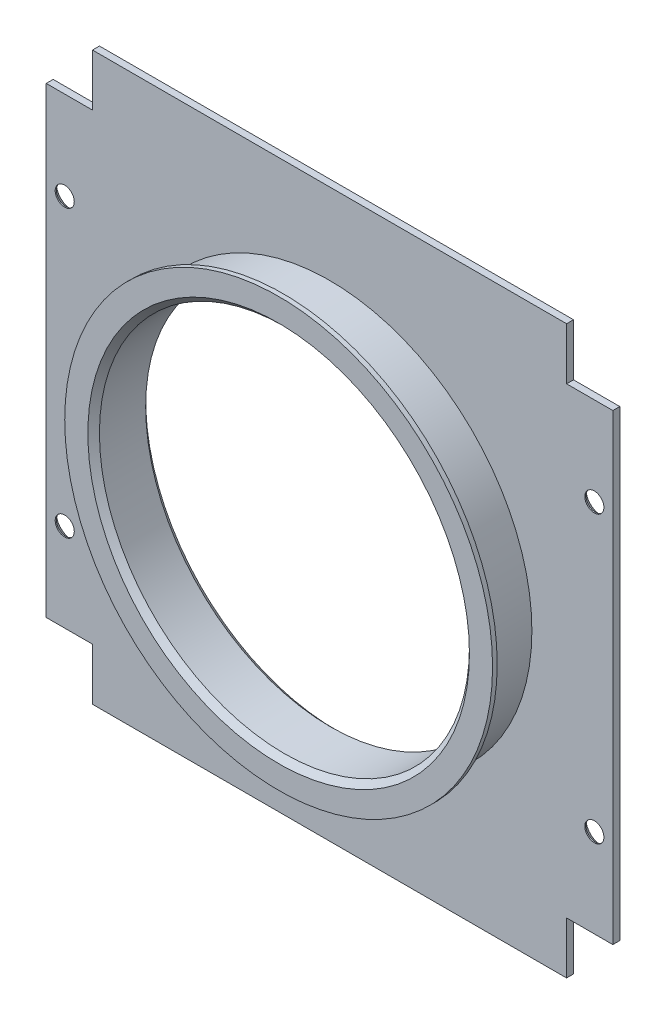
ISO-10303-21;
HEADER;
FILE_DESCRIPTION(('STEP AP214'),'2;1');
FILE_NAME('part.step','',(''),(''),'','','');
FILE_SCHEMA(('AUTOMOTIVE_DESIGN { 1 0 10303 214 1 1 1 1 }'));
ENDSEC;
DATA;
#1=APPLICATION_CONTEXT('core data for automotive mechanical design processes');
#2=APPLICATION_PROTOCOL_DEFINITION('international standard','automotive_design',2000,#1);
#3=PRODUCT_CONTEXT('',#1,'mechanical');
#4=PRODUCT('Part','Part','',(#3));
#5=PRODUCT_RELATED_PRODUCT_CATEGORY('part','',(#4));
#6=PRODUCT_DEFINITION_FORMATION('','',#4);
#7=PRODUCT_DEFINITION_CONTEXT('part definition',#1,'design');
#8=PRODUCT_DEFINITION('design','',#6,#7);
#9=PRODUCT_DEFINITION_SHAPE('','',#8);
#10=(LENGTH_UNIT() NAMED_UNIT(*) SI_UNIT(.MILLI.,.METRE.));
#11=(NAMED_UNIT(*) PLANE_ANGLE_UNIT() SI_UNIT($,.RADIAN.));
#12=(NAMED_UNIT(*) SI_UNIT($,.STERADIAN.) SOLID_ANGLE_UNIT());
#13=UNCERTAINTY_MEASURE_WITH_UNIT(LENGTH_MEASURE(1.E-05),#10,'distance_accuracy_value','');
#14=(GEOMETRIC_REPRESENTATION_CONTEXT(3) GLOBAL_UNCERTAINTY_ASSIGNED_CONTEXT((#13)) GLOBAL_UNIT_ASSIGNED_CONTEXT((#10,
#11,#12)) REPRESENTATION_CONTEXT('',''));
#15=CARTESIAN_POINT('',(0.,0.,0.));
#16=DIRECTION('',(0.,0.,1.));
#17=DIRECTION('',(1.,0.,0.));
#18=AXIS2_PLACEMENT_3D('',#15,#16,#17);
#19=CARTESIAN_POINT('',(-90.,9.,1.2));
#20=DIRECTION('',(1.,0.,0.));
#21=DIRECTION('',(0.,0.,-1.));
#22=AXIS2_PLACEMENT_3D('',#19,#20,#21);
#23=PLANE('',#22);
#24=DIRECTION('',(0.,-1.,0.));
#25=VECTOR('',#24,1.);
#26=CARTESIAN_POINT('',(-90.,9.,0.));
#27=LINE('',#26,#25);
#28=CARTESIAN_POINT('',(-90.,9.,0.));
#29=VERTEX_POINT('',#28);
#30=CARTESIAN_POINT('',(-90.,0.,0.));
#31=VERTEX_POINT('',#30);
#32=EDGE_CURVE('E167',#29,#31,#27,.T.);
#33=ORIENTED_EDGE('',*,*,#32,.T.);
#34=DIRECTION('',(0.,0.,-1.));
#35=VECTOR('',#34,1.);
#36=CARTESIAN_POINT('',(-90.,0.,1.2));
#37=LINE('',#36,#35);
#38=CARTESIAN_POINT('',(-90.,0.,1.2));
#39=VERTEX_POINT('',#38);
#40=EDGE_CURVE('E217',#39,#31,#37,.T.);
#41=ORIENTED_EDGE('',*,*,#40,.F.);
#42=DIRECTION('',(0.,-1.,0.));
#43=VECTOR('',#42,1.);
#44=CARTESIAN_POINT('',(-90.,9.,1.2));
#45=LINE('',#44,#43);
#46=CARTESIAN_POINT('',(-90.,9.,1.2));
#47=VERTEX_POINT('',#46);
#48=EDGE_CURVE('E194',#47,#39,#45,.T.);
#49=ORIENTED_EDGE('',*,*,#48,.F.);
#50=DIRECTION('',(0.,0.,-1.));
#51=VECTOR('',#50,1.);
#52=CARTESIAN_POINT('',(-90.,9.,1.2));
#53=LINE('',#52,#51);
#54=EDGE_CURVE('E168',#47,#29,#53,.T.);
#55=ORIENTED_EDGE('',*,*,#54,.T.);
#56=EDGE_LOOP('',(#33,#41,#49,#55));
#57=FACE_BOUND('',#56,.T.);
#58=ADVANCED_FACE('F50',(#57),#23,.F.);
#59=CARTESIAN_POINT('',(-90.,0.,1.2));
#60=DIRECTION('',(0.,1.,0.));
#61=DIRECTION('',(-1.,0.,0.));
#62=AXIS2_PLACEMENT_3D('',#59,#60,#61);
#63=PLANE('',#62);
#64=DIRECTION('',(1.,0.,0.));
#65=VECTOR('',#64,1.);
#66=CARTESIAN_POINT('',(-90.,0.,0.));
#67=LINE('',#66,#65);
#68=CARTESIAN_POINT('',(-8.,0.,0.));
#69=VERTEX_POINT('',#68);
#70=EDGE_CURVE('E173',#31,#69,#67,.T.);
#71=ORIENTED_EDGE('',*,*,#70,.T.);
#72=DIRECTION('',(0.,0.,-1.));
#73=VECTOR('',#72,1.);
#74=CARTESIAN_POINT('',(-8.,0.,1.2));
#75=LINE('',#74,#73);
#76=CARTESIAN_POINT('',(-8.,0.,1.2));
#77=VERTEX_POINT('',#76);
#78=EDGE_CURVE('E213',#77,#69,#75,.T.);
#79=ORIENTED_EDGE('',*,*,#78,.F.);
#80=DIRECTION('',(1.,0.,0.));
#81=VECTOR('',#80,1.);
#82=CARTESIAN_POINT('',(-90.,0.,1.2));
#83=LINE('',#82,#81);
#84=EDGE_CURVE('E122',#39,#77,#83,.T.);
#85=ORIENTED_EDGE('',*,*,#84,.F.);
#86=ORIENTED_EDGE('',*,*,#40,.T.);
#87=EDGE_LOOP('',(#71,#79,#85,#86));
#88=FACE_BOUND('',#87,.T.);
#89=ADVANCED_FACE('F303',(#88),#63,.F.);
#90=CARTESIAN_POINT('',(-8.,0.,1.2));
#91=DIRECTION('',(-1.,0.,0.));
#92=DIRECTION('',(0.,0.,1.));
#93=AXIS2_PLACEMENT_3D('',#90,#91,#92);
#94=PLANE('',#93);
#95=DIRECTION('',(0.,1.,0.));
#96=VECTOR('',#95,1.);
#97=CARTESIAN_POINT('',(-8.,0.,0.));
#98=LINE('',#97,#96);
#99=CARTESIAN_POINT('',(-8.,9.00000000000001,0.));
#100=VERTEX_POINT('',#99);
#101=EDGE_CURVE('E176',#69,#100,#98,.T.);
#102=ORIENTED_EDGE('',*,*,#101,.T.);
#103=DIRECTION('',(0.,0.,-1.));
#104=VECTOR('',#103,1.);
#105=CARTESIAN_POINT('',(-8.,9.00000000000001,1.2));
#106=LINE('',#105,#104);
#107=CARTESIAN_POINT('',(-8.,9.00000000000001,1.2));
#108=VERTEX_POINT('',#107);
#109=EDGE_CURVE('E215',#108,#100,#106,.T.);
#110=ORIENTED_EDGE('',*,*,#109,.F.);
#111=DIRECTION('',(0.,1.,0.));
#112=VECTOR('',#111,1.);
#113=CARTESIAN_POINT('',(-8.,0.,1.2));
#114=LINE('',#113,#112);
#115=EDGE_CURVE('E371',#77,#108,#114,.T.);
#116=ORIENTED_EDGE('',*,*,#115,.F.);
#117=ORIENTED_EDGE('',*,*,#78,.T.);
#118=EDGE_LOOP('',(#102,#110,#116,#117));
#119=FACE_BOUND('',#118,.T.);
#120=ADVANCED_FACE('F308',(#119),#94,.F.);
#121=CARTESIAN_POINT('',(-8.,9.00000000000001,1.2));
#122=DIRECTION('',(0.,1.,0.));
#123=DIRECTION('',(-1.,0.,0.));
#124=AXIS2_PLACEMENT_3D('',#121,#122,#123);
#125=PLANE('',#124);
#126=DIRECTION('',(1.,0.,0.));
#127=VECTOR('',#126,1.);
#128=CARTESIAN_POINT('',(-8.,9.00000000000001,0.));
#129=LINE('',#128,#127);
#130=CARTESIAN_POINT('',(0.,9.00000000000001,0.));
#131=VERTEX_POINT('',#130);
#132=EDGE_CURVE('E178',#100,#131,#129,.T.);
#133=ORIENTED_EDGE('',*,*,#132,.T.);
#134=DIRECTION('',(0.,0.,-1.));
#135=VECTOR('',#134,1.);
#136=CARTESIAN_POINT('',(0.,9.00000000000001,1.2));
#137=LINE('',#136,#135);
#138=CARTESIAN_POINT('',(0.,9.00000000000001,1.2));
#139=VERTEX_POINT('',#138);
#140=EDGE_CURVE('E209',#139,#131,#137,.T.);
#141=ORIENTED_EDGE('',*,*,#140,.F.);
#142=DIRECTION('',(1.,0.,0.));
#143=VECTOR('',#142,1.);
#144=CARTESIAN_POINT('',(-8.,9.00000000000001,1.2));
#145=LINE('',#144,#143);
#146=EDGE_CURVE('E373',#108,#139,#145,.T.);
#147=ORIENTED_EDGE('',*,*,#146,.F.);
#148=ORIENTED_EDGE('',*,*,#109,.T.);
#149=EDGE_LOOP('',(#133,#141,#147,#148));
#150=FACE_BOUND('',#149,.T.);
#151=ADVANCED_FACE('F409',(#150),#125,.F.);
#152=CARTESIAN_POINT('',(0.,9.00000000000001,1.2));
#153=DIRECTION('',(-1.,0.,0.));
#154=DIRECTION('',(0.,-1.,0.));
#155=AXIS2_PLACEMENT_3D('',#152,#153,#154);
#156=PLANE('',#155);
#157=DIRECTION('',(0.,1.,0.));
#158=VECTOR('',#157,1.);
#159=CARTESIAN_POINT('',(0.,9.00000000000001,0.));
#160=LINE('',#159,#158);
#161=CARTESIAN_POINT('',(0.,89.,0.));
#162=VERTEX_POINT('',#161);
#163=EDGE_CURVE('E179',#131,#162,#160,.T.);
#164=ORIENTED_EDGE('',*,*,#163,.T.);
#165=DIRECTION('',(0.,0.,-1.));
#166=VECTOR('',#165,1.);
#167=CARTESIAN_POINT('',(0.,89.,1.2));
#168=LINE('',#167,#166);
#169=CARTESIAN_POINT('',(0.,89.,1.2));
#170=VERTEX_POINT('',#169);
#171=EDGE_CURVE('E207',#170,#162,#168,.T.);
#172=ORIENTED_EDGE('',*,*,#171,.F.);
#173=DIRECTION('',(0.,1.,0.));
#174=VECTOR('',#173,1.);
#175=CARTESIAN_POINT('',(0.,9.00000000000001,1.2));
#176=LINE('',#175,#174);
#177=EDGE_CURVE('E374',#139,#170,#176,.T.);
#178=ORIENTED_EDGE('',*,*,#177,.F.);
#179=ORIENTED_EDGE('',*,*,#140,.T.);
#180=EDGE_LOOP('',(#164,#172,#178,#179));
#181=FACE_BOUND('',#180,.T.);
#182=ADVANCED_FACE('F404',(#181),#156,.F.);
#183=CARTESIAN_POINT('',(0.,89.,1.2));
#184=DIRECTION('',(0.,-1.,0.));
#185=DIRECTION('',(0.,0.,-1.));
#186=AXIS2_PLACEMENT_3D('',#183,#184,#185);
#187=PLANE('',#186);
#188=DIRECTION('',(-1.,0.,0.));
#189=VECTOR('',#188,1.);
#190=CARTESIAN_POINT('',(0.,89.,0.));
#191=LINE('',#190,#189);
#192=CARTESIAN_POINT('',(-8.,89.,0.));
#193=VERTEX_POINT('',#192);
#194=EDGE_CURVE('E185',#162,#193,#191,.T.);
#195=ORIENTED_EDGE('',*,*,#194,.T.);
#196=DIRECTION('',(0.,0.,-1.));
#197=VECTOR('',#196,1.);
#198=CARTESIAN_POINT('',(-8.,89.,1.2));
#199=LINE('',#198,#197);
#200=CARTESIAN_POINT('',(-8.,89.,1.2));
#201=VERTEX_POINT('',#200);
#202=EDGE_CURVE('E202',#201,#193,#199,.T.);
#203=ORIENTED_EDGE('',*,*,#202,.F.);
#204=DIRECTION('',(-1.,0.,0.));
#205=VECTOR('',#204,1.);
#206=CARTESIAN_POINT('',(0.,89.,1.2));
#207=LINE('',#206,#205);
#208=EDGE_CURVE('E380',#170,#201,#207,.T.);
#209=ORIENTED_EDGE('',*,*,#208,.F.);
#210=ORIENTED_EDGE('',*,*,#171,.T.);
#211=EDGE_LOOP('',(#195,#203,#209,#210));
#212=FACE_BOUND('',#211,.T.);
#213=ADVANCED_FACE('F396',(#212),#187,.F.);
#214=CARTESIAN_POINT('',(-8.,89.,1.2));
#215=DIRECTION('',(-1.,0.,0.));
#216=DIRECTION('',(0.,0.,1.));
#217=AXIS2_PLACEMENT_3D('',#214,#215,#216);
#218=PLANE('',#217);
#219=DIRECTION('',(0.,1.,0.));
#220=VECTOR('',#219,1.);
#221=CARTESIAN_POINT('',(-8.,89.,0.));
#222=LINE('',#221,#220);
#223=CARTESIAN_POINT('',(-8.,98.,0.));
#224=VERTEX_POINT('',#223);
#225=EDGE_CURVE('E183',#193,#224,#222,.T.);
#226=ORIENTED_EDGE('',*,*,#225,.T.);
#227=DIRECTION('',(0.,0.,-1.));
#228=VECTOR('',#227,1.);
#229=CARTESIAN_POINT('',(-8.,98.,1.2));
#230=LINE('',#229,#228);
#231=CARTESIAN_POINT('',(-8.,98.,1.2));
#232=VERTEX_POINT('',#231);
#233=EDGE_CURVE('E196',#232,#224,#230,.T.);
#234=ORIENTED_EDGE('',*,*,#233,.F.);
#235=DIRECTION('',(0.,1.,0.));
#236=VECTOR('',#235,1.);
#237=CARTESIAN_POINT('',(-8.,89.,1.2));
#238=LINE('',#237,#236);
#239=EDGE_CURVE('E378',#201,#232,#238,.T.);
#240=ORIENTED_EDGE('',*,*,#239,.F.);
#241=ORIENTED_EDGE('',*,*,#202,.T.);
#242=EDGE_LOOP('',(#226,#234,#240,#241));
#243=FACE_BOUND('',#242,.T.);
#244=ADVANCED_FACE('F398',(#243),#218,.F.);
#245=CARTESIAN_POINT('',(-8.,98.,1.2));
#246=DIRECTION('',(0.,-1.,0.));
#247=DIRECTION('',(0.,0.,-1.));
#248=AXIS2_PLACEMENT_3D('',#245,#246,#247);
#249=PLANE('',#248);
#250=DIRECTION('',(-1.,0.,0.));
#251=VECTOR('',#250,1.);
#252=CARTESIAN_POINT('',(-8.,98.,0.));
#253=LINE('',#252,#251);
#254=CARTESIAN_POINT('',(-90.,98.,0.));
#255=VERTEX_POINT('',#254);
#256=EDGE_CURVE('E187',#224,#255,#253,.T.);
#257=ORIENTED_EDGE('',*,*,#256,.T.);
#258=DIRECTION('',(0.,0.,-1.));
#259=VECTOR('',#258,1.);
#260=CARTESIAN_POINT('',(-90.,98.,1.2));
#261=LINE('',#260,#259);
#262=CARTESIAN_POINT('',(-90.,98.,1.2));
#263=VERTEX_POINT('',#262);
#264=EDGE_CURVE('E199',#263,#255,#261,.T.);
#265=ORIENTED_EDGE('',*,*,#264,.F.);
#266=DIRECTION('',(-1.,0.,0.));
#267=VECTOR('',#266,1.);
#268=CARTESIAN_POINT('',(-8.,98.,1.2));
#269=LINE('',#268,#267);
#270=EDGE_CURVE('E382',#232,#263,#269,.T.);
#271=ORIENTED_EDGE('',*,*,#270,.F.);
#272=ORIENTED_EDGE('',*,*,#233,.T.);
#273=EDGE_LOOP('',(#257,#265,#271,#272));
#274=FACE_BOUND('',#273,.T.);
#275=ADVANCED_FACE('F390',(#274),#249,.F.);
#276=CARTESIAN_POINT('',(-90.,98.,1.2));
#277=DIRECTION('',(1.,0.,0.));
#278=DIRECTION('',(0.,0.,-1.));
#279=AXIS2_PLACEMENT_3D('',#276,#277,#278);
#280=PLANE('',#279);
#281=DIRECTION('',(0.,-1.,0.));
#282=VECTOR('',#281,1.);
#283=CARTESIAN_POINT('',(-90.,98.,0.));
#284=LINE('',#283,#282);
#285=CARTESIAN_POINT('',(-90.,89.,0.));
#286=VERTEX_POINT('',#285);
#287=EDGE_CURVE('E189',#255,#286,#284,.T.);
#288=ORIENTED_EDGE('',*,*,#287,.T.);
#289=DIRECTION('',(0.,0.,-1.));
#290=VECTOR('',#289,1.);
#291=CARTESIAN_POINT('',(-90.,89.,1.2));
#292=LINE('',#291,#290);
#293=CARTESIAN_POINT('',(-90.,89.,1.2));
#294=VERTEX_POINT('',#293);
#295=EDGE_CURVE('E163',#294,#286,#292,.T.);
#296=ORIENTED_EDGE('',*,*,#295,.F.);
#297=DIRECTION('',(0.,-1.,0.));
#298=VECTOR('',#297,1.);
#299=CARTESIAN_POINT('',(-90.,98.,1.2));
#300=LINE('',#299,#298);
#301=EDGE_CURVE('E154',#263,#294,#300,.T.);
#302=ORIENTED_EDGE('',*,*,#301,.F.);
#303=ORIENTED_EDGE('',*,*,#264,.T.);
#304=EDGE_LOOP('',(#288,#296,#302,#303));
#305=FACE_BOUND('',#304,.T.);
#306=ADVANCED_FACE('F393',(#305),#280,.F.);
#307=CARTESIAN_POINT('',(-90.,89.,1.2));
#308=DIRECTION('',(0.,-1.,0.));
#309=DIRECTION('',(0.,0.,-1.));
#310=AXIS2_PLACEMENT_3D('',#307,#308,#309);
#311=PLANE('',#310);
#312=DIRECTION('',(-1.,0.,0.));
#313=VECTOR('',#312,1.);
#314=CARTESIAN_POINT('',(-90.,89.,0.));
#315=LINE('',#314,#313);
#316=CARTESIAN_POINT('',(-98.,89.,0.));
#317=VERTEX_POINT('',#316);
#318=EDGE_CURVE('E156',#286,#317,#315,.T.);
#319=ORIENTED_EDGE('',*,*,#318,.T.);
#320=DIRECTION('',(0.,0.,-1.));
#321=VECTOR('',#320,1.);
#322=CARTESIAN_POINT('',(-98.,89.,1.2));
#323=LINE('',#322,#321);
#324=CARTESIAN_POINT('',(-98.,89.,1.2));
#325=VERTEX_POINT('',#324);
#326=EDGE_CURVE('E159',#325,#317,#323,.T.);
#327=ORIENTED_EDGE('',*,*,#326,.F.);
#328=DIRECTION('',(-1.,0.,0.));
#329=VECTOR('',#328,1.);
#330=CARTESIAN_POINT('',(-90.,89.,1.2));
#331=LINE('',#330,#329);
#332=EDGE_CURVE('E147',#294,#325,#331,.T.);
#333=ORIENTED_EDGE('',*,*,#332,.F.);
#334=ORIENTED_EDGE('',*,*,#295,.T.);
#335=EDGE_LOOP('',(#319,#327,#333,#334));
#336=FACE_BOUND('',#335,.T.);
#337=ADVANCED_FACE('F157',(#336),#311,.F.);
#338=CARTESIAN_POINT('',(-98.,89.,1.2));
#339=DIRECTION('',(1.,0.,0.));
#340=DIRECTION('',(0.,1.,0.));
#341=AXIS2_PLACEMENT_3D('',#338,#339,#340);
#342=PLANE('',#341);
#343=DIRECTION('',(0.,-1.,0.));
#344=VECTOR('',#343,1.);
#345=CARTESIAN_POINT('',(-98.,89.,0.));
#346=LINE('',#345,#344);
#347=CARTESIAN_POINT('',(-98.,9.,0.));
#348=VERTEX_POINT('',#347);
#349=EDGE_CURVE('E106',#317,#348,#346,.T.);
#350=ORIENTED_EDGE('',*,*,#349,.T.);
#351=DIRECTION('',(0.,0.,-1.));
#352=VECTOR('',#351,1.);
#353=CARTESIAN_POINT('',(-98.,9.,1.2));
#354=LINE('',#353,#352);
#355=CARTESIAN_POINT('',(-98.,9.,1.2));
#356=VERTEX_POINT('',#355);
#357=EDGE_CURVE('E162',#356,#348,#354,.T.);
#358=ORIENTED_EDGE('',*,*,#357,.F.);
#359=DIRECTION('',(0.,-1.,0.));
#360=VECTOR('',#359,1.);
#361=CARTESIAN_POINT('',(-98.,89.,1.2));
#362=LINE('',#361,#360);
#363=EDGE_CURVE('E148',#325,#356,#362,.T.);
#364=ORIENTED_EDGE('',*,*,#363,.F.);
#365=ORIENTED_EDGE('',*,*,#326,.T.);
#366=EDGE_LOOP('',(#350,#358,#364,#365));
#367=FACE_BOUND('',#366,.T.);
#368=ADVANCED_FACE('F165',(#367),#342,.F.);
#369=CARTESIAN_POINT('',(-98.,9.,1.2));
#370=DIRECTION('',(0.,1.,0.));
#371=DIRECTION('',(-1.,0.,0.));
#372=AXIS2_PLACEMENT_3D('',#369,#370,#371);
#373=PLANE('',#372);
#374=DIRECTION('',(1.,0.,0.));
#375=VECTOR('',#374,1.);
#376=CARTESIAN_POINT('',(-98.,9.,0.));
#377=LINE('',#376,#375);
#378=EDGE_CURVE('E115',#348,#29,#377,.T.);
#379=ORIENTED_EDGE('',*,*,#378,.T.);
#380=ORIENTED_EDGE('',*,*,#54,.F.);
#381=DIRECTION('',(1.,0.,0.));
#382=VECTOR('',#381,1.);
#383=CARTESIAN_POINT('',(-98.,9.,1.2));
#384=LINE('',#383,#382);
#385=EDGE_CURVE('E63',#356,#47,#384,.T.);
#386=ORIENTED_EDGE('',*,*,#385,.F.);
#387=ORIENTED_EDGE('',*,*,#357,.T.);
#388=EDGE_LOOP('',(#379,#380,#386,#387));
#389=FACE_BOUND('',#388,.T.);
#390=ADVANCED_FACE('F292',(#389),#373,.F.);
#391=CARTESIAN_POINT('',(0.,0.,1.2));
#392=DIRECTION('',(0.,0.,1.));
#393=DIRECTION('',(1.,0.,0.));
#394=AXIS2_PLACEMENT_3D('',#391,#392,#393);
#395=PLANE('',#394);
#396=CARTESIAN_POINT('',(-49.,49.,1.2));
#397=DIRECTION('',(0.,0.,1.));
#398=DIRECTION('',(1.,0.,0.));
#399=AXIS2_PLACEMENT_3D('',#396,#397,#398);
#400=CIRCLE('',#399,35.);
#401=CARTESIAN_POINT('',(-14.,49.,1.2));
#402=VERTEX_POINT('',#401);
#403=EDGE_CURVE('E216',#402,#402,#400,.T.);
#404=ORIENTED_EDGE('',*,*,#403,.F.);
#405=EDGE_LOOP('',(#404));
#406=FACE_BOUND('',#405,.T.);
#407=CARTESIAN_POINT('',(-3.2,73.7,1.2));
#408=DIRECTION('',(0.,0.,1.));
#409=DIRECTION('',(1.,0.,0.));
#410=AXIS2_PLACEMENT_3D('',#407,#408,#409);
#411=CIRCLE('',#410,1.65);
#412=CARTESIAN_POINT('',(-1.55,73.7,1.2));
#413=VERTEX_POINT('',#412);
#414=EDGE_CURVE('E363',#413,#413,#411,.T.);
#415=ORIENTED_EDGE('',*,*,#414,.F.);
#416=EDGE_LOOP('',(#415));
#417=FACE_BOUND('',#416,.T.);
#418=CARTESIAN_POINT('',(-3.19999999999999,24.3,1.2));
#419=DIRECTION('',(0.,0.,1.));
#420=DIRECTION('',(1.,0.,0.));
#421=AXIS2_PLACEMENT_3D('',#418,#419,#420);
#422=CIRCLE('',#421,1.65);
#423=CARTESIAN_POINT('',(-1.55,24.3,1.2));
#424=VERTEX_POINT('',#423);
#425=EDGE_CURVE('E358',#424,#424,#422,.T.);
#426=ORIENTED_EDGE('',*,*,#425,.F.);
#427=EDGE_LOOP('',(#426));
#428=FACE_BOUND('',#427,.T.);
#429=CARTESIAN_POINT('',(-94.8,24.3,1.2));
#430=DIRECTION('',(0.,0.,1.));
#431=DIRECTION('',(1.,0.,0.));
#432=AXIS2_PLACEMENT_3D('',#429,#430,#431);
#433=CIRCLE('',#432,1.65);
#434=CARTESIAN_POINT('',(-93.15,24.3,1.2));
#435=VERTEX_POINT('',#434);
#436=EDGE_CURVE('E355',#435,#435,#433,.T.);
#437=ORIENTED_EDGE('',*,*,#436,.F.);
#438=EDGE_LOOP('',(#437));
#439=FACE_BOUND('',#438,.T.);
#440=CARTESIAN_POINT('',(-94.8,73.7,1.2));
#441=DIRECTION('',(0.,0.,1.));
#442=DIRECTION('',(1.,0.,0.));
#443=AXIS2_PLACEMENT_3D('',#440,#441,#442);
#444=CIRCLE('',#443,1.65);
#445=CARTESIAN_POINT('',(-93.15,73.7,1.2));
#446=VERTEX_POINT('',#445);
#447=EDGE_CURVE('E172',#446,#446,#444,.T.);
#448=ORIENTED_EDGE('',*,*,#447,.F.);
#449=EDGE_LOOP('',(#448));
#450=FACE_BOUND('',#449,.T.);
#451=ORIENTED_EDGE('',*,*,#48,.T.);
#452=ORIENTED_EDGE('',*,*,#84,.T.);
#453=ORIENTED_EDGE('',*,*,#115,.T.);
#454=ORIENTED_EDGE('',*,*,#146,.T.);
#455=ORIENTED_EDGE('',*,*,#177,.T.);
#456=ORIENTED_EDGE('',*,*,#208,.T.);
#457=ORIENTED_EDGE('',*,*,#239,.T.);
#458=ORIENTED_EDGE('',*,*,#270,.T.);
#459=ORIENTED_EDGE('',*,*,#301,.T.);
#460=ORIENTED_EDGE('',*,*,#332,.T.);
#461=ORIENTED_EDGE('',*,*,#363,.T.);
#462=ORIENTED_EDGE('',*,*,#385,.T.);
#463=EDGE_LOOP('',(#451,#452,#453,#454,#455,#456,#457,#458,#459,#460,#461,#462));
#464=FACE_BOUND('',#463,.T.);
#465=ADVANCED_FACE('F149',(#406,#417,#428,#439,#450,#464),#395,.T.);
#466=CARTESIAN_POINT('',(0.,0.,0.));
#467=DIRECTION('',(0.,0.,1.));
#468=DIRECTION('',(1.,0.,0.));
#469=AXIS2_PLACEMENT_3D('',#466,#467,#468);
#470=PLANE('',#469);
#471=CARTESIAN_POINT('',(-49.,49.,0.));
#472=DIRECTION('',(0.,0.,1.));
#473=DIRECTION('',(1.,0.,0.));
#474=AXIS2_PLACEMENT_3D('',#471,#472,#473);
#475=CIRCLE('',#474,33.);
#476=CARTESIAN_POINT('',(-16.,49.,0.));
#477=VERTEX_POINT('',#476);
#478=EDGE_CURVE('E11',#477,#477,#475,.T.);
#479=ORIENTED_EDGE('',*,*,#478,.T.);
#480=EDGE_LOOP('',(#479));
#481=FACE_BOUND('',#480,.T.);
#482=CARTESIAN_POINT('',(-3.19999999999999,24.3,0.));
#483=DIRECTION('',(0.,0.,1.));
#484=DIRECTION('',(1.,0.,0.));
#485=AXIS2_PLACEMENT_3D('',#482,#483,#484);
#486=CIRCLE('',#485,2.65);
#487=CARTESIAN_POINT('',(-0.549999999999994,24.3,0.));
#488=VERTEX_POINT('',#487);
#489=EDGE_CURVE('E229',#488,#488,#486,.T.);
#490=ORIENTED_EDGE('',*,*,#489,.T.);
#491=EDGE_LOOP('',(#490));
#492=FACE_BOUND('',#491,.T.);
#493=CARTESIAN_POINT('',(-3.2,73.7,0.));
#494=DIRECTION('',(0.,0.,1.));
#495=DIRECTION('',(1.,0.,0.));
#496=AXIS2_PLACEMENT_3D('',#493,#494,#495);
#497=CIRCLE('',#496,2.65);
#498=CARTESIAN_POINT('',(-0.549999999999999,73.7,0.));
#499=VERTEX_POINT('',#498);
#500=EDGE_CURVE('E227',#499,#499,#497,.T.);
#501=ORIENTED_EDGE('',*,*,#500,.T.);
#502=EDGE_LOOP('',(#501));
#503=FACE_BOUND('',#502,.T.);
#504=CARTESIAN_POINT('',(-94.8,73.7,0.));
#505=DIRECTION('',(0.,0.,1.));
#506=DIRECTION('',(1.,0.,0.));
#507=AXIS2_PLACEMENT_3D('',#504,#505,#506);
#508=CIRCLE('',#507,2.64999999999997);
#509=CARTESIAN_POINT('',(-92.15,73.7,0.));
#510=VERTEX_POINT('',#509);
#511=EDGE_CURVE('E225',#510,#510,#508,.T.);
#512=ORIENTED_EDGE('',*,*,#511,.T.);
#513=EDGE_LOOP('',(#512));
#514=FACE_BOUND('',#513,.T.);
#515=CARTESIAN_POINT('',(-94.8,24.3,0.));
#516=DIRECTION('',(0.,0.,1.));
#517=DIRECTION('',(1.,0.,0.));
#518=AXIS2_PLACEMENT_3D('',#515,#516,#517);
#519=CIRCLE('',#518,2.64999999999997);
#520=CARTESIAN_POINT('',(-92.15,24.3,0.));
#521=VERTEX_POINT('',#520);
#522=EDGE_CURVE('E223',#521,#521,#519,.T.);
#523=ORIENTED_EDGE('',*,*,#522,.T.);
#524=EDGE_LOOP('',(#523));
#525=FACE_BOUND('',#524,.T.);
#526=ORIENTED_EDGE('',*,*,#32,.F.);
#527=ORIENTED_EDGE('',*,*,#378,.F.);
#528=ORIENTED_EDGE('',*,*,#349,.F.);
#529=ORIENTED_EDGE('',*,*,#318,.F.);
#530=ORIENTED_EDGE('',*,*,#287,.F.);
#531=ORIENTED_EDGE('',*,*,#256,.F.);
#532=ORIENTED_EDGE('',*,*,#225,.F.);
#533=ORIENTED_EDGE('',*,*,#194,.F.);
#534=ORIENTED_EDGE('',*,*,#163,.F.);
#535=ORIENTED_EDGE('',*,*,#132,.F.);
#536=ORIENTED_EDGE('',*,*,#101,.F.);
#537=ORIENTED_EDGE('',*,*,#70,.F.);
#538=EDGE_LOOP('',(#526,#527,#528,#529,#530,#531,#532,#533,#534,#535,#536,#537));
#539=FACE_BOUND('',#538,.T.);
#540=ADVANCED_FACE('F274',(#481,#492,#503,#514,#525,#539),#470,.F.);
#541=CARTESIAN_POINT('',(-94.8,73.7,0.));
#542=DIRECTION('',(0.,0.,1.));
#543=DIRECTION('',(1.,0.,0.));
#544=AXIS2_PLACEMENT_3D('',#541,#542,#543);
#545=CYLINDRICAL_SURFACE('',#544,1.65);
#546=CARTESIAN_POINT('',(-94.8,73.7,0.999999999999976));
#547=DIRECTION('',(0.,0.,1.));
#548=DIRECTION('',(1.,0.,0.));
#549=AXIS2_PLACEMENT_3D('',#546,#547,#548);
#550=CIRCLE('',#549,1.65);
#551=CARTESIAN_POINT('',(-93.15,73.7,0.999999999999976));
#552=VERTEX_POINT('',#551);
#553=EDGE_CURVE('E237',#552,#552,#550,.F.);
#554=ORIENTED_EDGE('',*,*,#553,.T.);
#555=EDGE_LOOP('',(#554));
#556=FACE_BOUND('',#555,.T.);
#557=ORIENTED_EDGE('',*,*,#447,.T.);
#558=EDGE_LOOP('',(#557));
#559=FACE_BOUND('',#558,.T.);
#560=ADVANCED_FACE('F280',(#556,#559),#545,.F.);
#561=CARTESIAN_POINT('',(-94.8,24.3,0.));
#562=DIRECTION('',(0.,0.,1.));
#563=DIRECTION('',(1.,0.,0.));
#564=AXIS2_PLACEMENT_3D('',#561,#562,#563);
#565=CYLINDRICAL_SURFACE('',#564,1.65);
#566=CARTESIAN_POINT('',(-94.8,24.3,0.999999999999976));
#567=DIRECTION('',(0.,0.,1.));
#568=DIRECTION('',(1.,0.,0.));
#569=AXIS2_PLACEMENT_3D('',#566,#567,#568);
#570=CIRCLE('',#569,1.65);
#571=CARTESIAN_POINT('',(-93.15,24.3,0.999999999999976));
#572=VERTEX_POINT('',#571);
#573=EDGE_CURVE('E245',#572,#572,#570,.F.);
#574=ORIENTED_EDGE('',*,*,#573,.T.);
#575=EDGE_LOOP('',(#574));
#576=FACE_BOUND('',#575,.T.);
#577=ORIENTED_EDGE('',*,*,#436,.T.);
#578=EDGE_LOOP('',(#577));
#579=FACE_BOUND('',#578,.T.);
#580=ADVANCED_FACE('F349',(#576,#579),#565,.F.);
#581=CARTESIAN_POINT('',(-3.19999999999999,24.3,0.));
#582=DIRECTION('',(0.,0.,1.));
#583=DIRECTION('',(1.,0.,0.));
#584=AXIS2_PLACEMENT_3D('',#581,#582,#583);
#585=CYLINDRICAL_SURFACE('',#584,1.65);
#586=CARTESIAN_POINT('',(-3.19999999999999,24.3,0.999999999999995));
#587=DIRECTION('',(0.,0.,1.));
#588=DIRECTION('',(1.,0.,0.));
#589=AXIS2_PLACEMENT_3D('',#586,#587,#588);
#590=CIRCLE('',#589,1.65);
#591=CARTESIAN_POINT('',(-1.55,24.3,0.999999999999995));
#592=VERTEX_POINT('',#591);
#593=EDGE_CURVE('E231',#592,#592,#590,.F.);
#594=ORIENTED_EDGE('',*,*,#593,.T.);
#595=EDGE_LOOP('',(#594));
#596=FACE_BOUND('',#595,.T.);
#597=ORIENTED_EDGE('',*,*,#425,.T.);
#598=EDGE_LOOP('',(#597));
#599=FACE_BOUND('',#598,.T.);
#600=ADVANCED_FACE('F346',(#596,#599),#585,.F.);
#601=CARTESIAN_POINT('',(-3.2,73.7,0.));
#602=DIRECTION('',(0.,0.,1.));
#603=DIRECTION('',(1.,0.,0.));
#604=AXIS2_PLACEMENT_3D('',#601,#602,#603);
#605=CYLINDRICAL_SURFACE('',#604,1.65);
#606=CARTESIAN_POINT('',(-3.2,73.7,0.999999999999995));
#607=DIRECTION('',(0.,0.,1.));
#608=DIRECTION('',(1.,0.,0.));
#609=AXIS2_PLACEMENT_3D('',#606,#607,#608);
#610=CIRCLE('',#609,1.65);
#611=CARTESIAN_POINT('',(-1.55,73.7,0.999999999999995));
#612=VERTEX_POINT('',#611);
#613=EDGE_CURVE('E236',#612,#612,#610,.F.);
#614=ORIENTED_EDGE('',*,*,#613,.T.);
#615=EDGE_LOOP('',(#614));
#616=FACE_BOUND('',#615,.T.);
#617=ORIENTED_EDGE('',*,*,#414,.T.);
#618=EDGE_LOOP('',(#617));
#619=FACE_BOUND('',#618,.T.);
#620=ADVANCED_FACE('F482',(#616,#619),#605,.F.);
#621=CARTESIAN_POINT('',(-49.,49.,9.2));
#622=DIRECTION('',(0.,0.,-1.));
#623=DIRECTION('',(-1.,0.,0.));
#624=AXIS2_PLACEMENT_3D('',#621,#622,#623);
#625=CYLINDRICAL_SURFACE('',#624,35.);
#626=CARTESIAN_POINT('',(-49.,49.,9.2));
#627=DIRECTION('',(0.,0.,1.));
#628=DIRECTION('',(1.,0.,0.));
#629=AXIS2_PLACEMENT_3D('',#626,#627,#628);
#630=CIRCLE('',#629,35.);
#631=CARTESIAN_POINT('',(-14.,49.,9.2));
#632=VERTEX_POINT('',#631);
#633=EDGE_CURVE('E370',#632,#632,#630,.T.);
#634=ORIENTED_EDGE('',*,*,#633,.F.);
#635=EDGE_LOOP('',(#634));
#636=FACE_BOUND('',#635,.T.);
#637=ORIENTED_EDGE('',*,*,#403,.T.);
#638=EDGE_LOOP('',(#637));
#639=FACE_BOUND('',#638,.T.);
#640=ADVANCED_FACE('F491',(#636,#639),#625,.T.);
#641=CARTESIAN_POINT('',(-49.,49.,10.));
#642=DIRECTION('',(0.,0.,-1.));
#643=DIRECTION('',(-1.,0.,0.));
#644=AXIS2_PLACEMENT_3D('',#641,#642,#643);
#645=CYLINDRICAL_SURFACE('',#644,37.);
#646=CARTESIAN_POINT('',(-49.,49.,10.));
#647=DIRECTION('',(0.,0.,1.));
#648=DIRECTION('',(1.,0.,0.));
#649=AXIS2_PLACEMENT_3D('',#646,#647,#648);
#650=CIRCLE('',#649,37.);
#651=CARTESIAN_POINT('',(-12.,49.,10.));
#652=VERTEX_POINT('',#651);
#653=EDGE_CURVE('E580',#652,#652,#650,.T.);
#654=ORIENTED_EDGE('',*,*,#653,.F.);
#655=EDGE_LOOP('',(#654));
#656=FACE_BOUND('',#655,.T.);
#657=CARTESIAN_POINT('',(-49.,49.,9.2));
#658=DIRECTION('',(0.,0.,1.));
#659=DIRECTION('',(1.,0.,0.));
#660=AXIS2_PLACEMENT_3D('',#657,#658,#659);
#661=CIRCLE('',#660,37.);
#662=CARTESIAN_POINT('',(-12.,49.,9.2));
#663=VERTEX_POINT('',#662);
#664=EDGE_CURVE('E574',#663,#663,#661,.T.);
#665=ORIENTED_EDGE('',*,*,#664,.T.);
#666=EDGE_LOOP('',(#665));
#667=FACE_BOUND('',#666,.T.);
#668=ADVANCED_FACE('F505',(#656,#667),#645,.T.);
#669=CARTESIAN_POINT('',(-49.,49.,10.));
#670=DIRECTION('',(0.,0.,1.));
#671=DIRECTION('',(1.,0.,0.));
#672=AXIS2_PLACEMENT_3D('',#669,#670,#671);
#673=PLANE('',#672);
#674=CARTESIAN_POINT('',(-49.,49.,10.));
#675=DIRECTION('',(0.,0.,1.));
#676=DIRECTION('',(1.,0.,0.));
#677=AXIS2_PLACEMENT_3D('',#674,#675,#676);
#678=CIRCLE('',#677,33.);
#679=CARTESIAN_POINT('',(-16.,49.,10.));
#680=VERTEX_POINT('',#679);
#681=EDGE_CURVE('E60',#680,#680,#678,.F.);
#682=ORIENTED_EDGE('',*,*,#681,.T.);
#683=EDGE_LOOP('',(#682));
#684=FACE_BOUND('',#683,.T.);
#685=ORIENTED_EDGE('',*,*,#653,.T.);
#686=EDGE_LOOP('',(#685));
#687=FACE_BOUND('',#686,.T.);
#688=ADVANCED_FACE('F254',(#684,#687),#673,.T.);
#689=CARTESIAN_POINT('',(-49.,49.,9.2));
#690=DIRECTION('',(0.,0.,1.));
#691=DIRECTION('',(1.,0.,0.));
#692=AXIS2_PLACEMENT_3D('',#689,#690,#691);
#693=PLANE('',#692);
#694=ORIENTED_EDGE('',*,*,#633,.T.);
#695=EDGE_LOOP('',(#694));
#696=FACE_BOUND('',#695,.T.);
#697=ORIENTED_EDGE('',*,*,#664,.F.);
#698=EDGE_LOOP('',(#697));
#699=FACE_BOUND('',#698,.T.);
#700=ADVANCED_FACE('F268',(#696,#699),#693,.F.);
#701=CARTESIAN_POINT('',(-49.,49.,0.));
#702=DIRECTION('',(0.,0.,1.));
#703=DIRECTION('',(1.,0.,0.));
#704=AXIS2_PLACEMENT_3D('',#701,#702,#703);
#705=CYLINDRICAL_SURFACE('',#704,32.);
#706=CARTESIAN_POINT('',(-49.,49.,9.00000000000003));
#707=DIRECTION('',(0.,0.,1.));
#708=DIRECTION('',(1.,0.,0.));
#709=AXIS2_PLACEMENT_3D('',#706,#707,#708);
#710=CIRCLE('',#709,32.);
#711=CARTESIAN_POINT('',(-17.,49.,9.00000000000003));
#712=VERTEX_POINT('',#711);
#713=EDGE_CURVE('E247',#712,#712,#710,.T.);
#714=ORIENTED_EDGE('',*,*,#713,.T.);
#715=EDGE_LOOP('',(#714));
#716=FACE_BOUND('',#715,.T.);
#717=CARTESIAN_POINT('',(-49.,49.,1.));
#718=DIRECTION('',(0.,0.,1.));
#719=DIRECTION('',(1.,0.,0.));
#720=AXIS2_PLACEMENT_3D('',#717,#718,#719);
#721=CIRCLE('',#720,32.);
#722=CARTESIAN_POINT('',(-17.,49.,1.));
#723=VERTEX_POINT('',#722);
#724=EDGE_CURVE('E244',#723,#723,#721,.F.);
#725=ORIENTED_EDGE('',*,*,#724,.T.);
#726=EDGE_LOOP('',(#725));
#727=FACE_BOUND('',#726,.T.);
#728=ADVANCED_FACE('F264',(#716,#727),#705,.F.);
#729=CARTESIAN_POINT('',(-3.19999999999999,24.3,0.));
#730=DIRECTION('',(0.,0.,-1.));
#731=DIRECTION('',(-1.,0.,0.));
#732=AXIS2_PLACEMENT_3D('',#729,#730,#731);
#733=CONICAL_SURFACE('',#732,2.65,0.785398163397451);
#734=ORIENTED_EDGE('',*,*,#593,.F.);
#735=EDGE_LOOP('',(#734));
#736=FACE_BOUND('',#735,.T.);
#737=ORIENTED_EDGE('',*,*,#489,.F.);
#738=EDGE_LOOP('',(#737));
#739=FACE_BOUND('',#738,.T.);
#740=ADVANCED_FACE('F261',(#736,#739),#733,.F.);
#741=CARTESIAN_POINT('',(-3.2,73.7,0.));
#742=DIRECTION('',(0.,0.,-1.));
#743=DIRECTION('',(-1.,0.,0.));
#744=AXIS2_PLACEMENT_3D('',#741,#742,#743);
#745=CONICAL_SURFACE('',#744,2.65,0.785398163397451);
#746=ORIENTED_EDGE('',*,*,#613,.F.);
#747=EDGE_LOOP('',(#746));
#748=FACE_BOUND('',#747,.T.);
#749=ORIENTED_EDGE('',*,*,#500,.F.);
#750=EDGE_LOOP('',(#749));
#751=FACE_BOUND('',#750,.T.);
#752=ADVANCED_FACE('F319',(#748,#751),#745,.F.);
#753=CARTESIAN_POINT('',(-94.8,73.7,0.));
#754=DIRECTION('',(0.,0.,-1.));
#755=DIRECTION('',(-1.,0.,0.));
#756=AXIS2_PLACEMENT_3D('',#753,#754,#755);
#757=CONICAL_SURFACE('',#756,2.64999999999997,0.785398163397445);
#758=ORIENTED_EDGE('',*,*,#553,.F.);
#759=EDGE_LOOP('',(#758));
#760=FACE_BOUND('',#759,.T.);
#761=ORIENTED_EDGE('',*,*,#511,.F.);
#762=EDGE_LOOP('',(#761));
#763=FACE_BOUND('',#762,.T.);
#764=ADVANCED_FACE('F323',(#760,#763),#757,.F.);
#765=CARTESIAN_POINT('',(-94.8,24.3,0.));
#766=DIRECTION('',(0.,0.,-1.));
#767=DIRECTION('',(-1.,0.,0.));
#768=AXIS2_PLACEMENT_3D('',#765,#766,#767);
#769=CONICAL_SURFACE('',#768,2.64999999999997,0.785398163397445);
#770=ORIENTED_EDGE('',*,*,#573,.F.);
#771=EDGE_LOOP('',(#770));
#772=FACE_BOUND('',#771,.T.);
#773=ORIENTED_EDGE('',*,*,#522,.F.);
#774=EDGE_LOOP('',(#773));
#775=FACE_BOUND('',#774,.T.);
#776=ADVANCED_FACE('F256',(#772,#775),#769,.F.);
#777=CARTESIAN_POINT('',(-49.,49.,9.00000000000003));
#778=DIRECTION('',(0.,0.,1.));
#779=DIRECTION('',(1.,0.,0.));
#780=AXIS2_PLACEMENT_3D('',#777,#778,#779);
#781=CONICAL_SURFACE('',#780,32.,0.785398163397448);
#782=ORIENTED_EDGE('',*,*,#681,.F.);
#783=EDGE_LOOP('',(#782));
#784=FACE_BOUND('',#783,.T.);
#785=ORIENTED_EDGE('',*,*,#713,.F.);
#786=EDGE_LOOP('',(#785));
#787=FACE_BOUND('',#786,.T.);
#788=ADVANCED_FACE('F257',(#784,#787),#781,.F.);
#789=CARTESIAN_POINT('',(-49.,49.,0.));
#790=DIRECTION('',(0.,0.,-1.));
#791=DIRECTION('',(-1.,0.,0.));
#792=AXIS2_PLACEMENT_3D('',#789,#790,#791);
#793=CONICAL_SURFACE('',#792,33.,0.785398163397448);
#794=ORIENTED_EDGE('',*,*,#724,.F.);
#795=EDGE_LOOP('',(#794));
#796=FACE_BOUND('',#795,.T.);
#797=ORIENTED_EDGE('',*,*,#478,.F.);
#798=EDGE_LOOP('',(#797));
#799=FACE_BOUND('',#798,.T.);
#800=ADVANCED_FACE('F49',(#796,#799),#793,.F.);
#801=CLOSED_SHELL('',(#58,#89,#120,#151,#182,#213,#244,#275,#306,#337,#368,#390,#465,#540,#560,
#580,#600,#620,#640,#668,#688,#700,#728,#740,#752,#764,#776,#788,#800));
#802=MANIFOLD_SOLID_BREP('B2',#801);
#803=ADVANCED_BREP_SHAPE_REPRESENTATION('',(#18,#802),#14);
#804=SHAPE_DEFINITION_REPRESENTATION(#9,#803);
ENDSEC;
END-ISO-10303-21;
